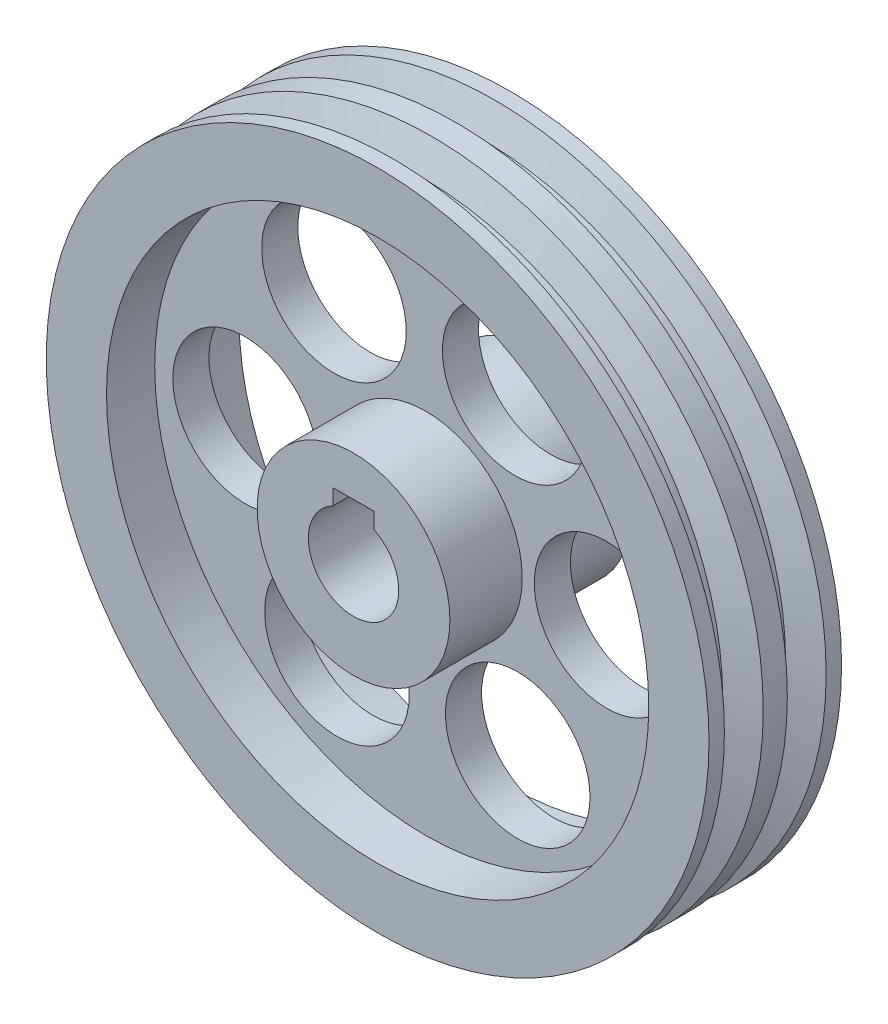
ISO-10303-21;
HEADER;
FILE_DESCRIPTION(('STEP AP214'),'2;1');
FILE_NAME('part.step','',(''),(''),'','','');
FILE_SCHEMA(('AUTOMOTIVE_DESIGN { 1 0 10303 214 1 1 1 1 }'));
ENDSEC;
DATA;
#1=APPLICATION_CONTEXT('core data for automotive mechanical design processes');
#2=APPLICATION_PROTOCOL_DEFINITION('international standard','automotive_design',2000,#1);
#3=PRODUCT_CONTEXT('',#1,'mechanical');
#4=PRODUCT('Part','Part','',(#3));
#5=PRODUCT_RELATED_PRODUCT_CATEGORY('part','',(#4));
#6=PRODUCT_DEFINITION_FORMATION('','',#4);
#7=PRODUCT_DEFINITION_CONTEXT('part definition',#1,'design');
#8=PRODUCT_DEFINITION('design','',#6,#7);
#9=PRODUCT_DEFINITION_SHAPE('','',#8);
#10=(LENGTH_UNIT() NAMED_UNIT(*) SI_UNIT(.MILLI.,.METRE.));
#11=(NAMED_UNIT(*) PLANE_ANGLE_UNIT() SI_UNIT($,.RADIAN.));
#12=(NAMED_UNIT(*) SI_UNIT($,.STERADIAN.) SOLID_ANGLE_UNIT());
#13=UNCERTAINTY_MEASURE_WITH_UNIT(LENGTH_MEASURE(1.E-05),#10,'distance_accuracy_value','');
#14=(GEOMETRIC_REPRESENTATION_CONTEXT(3) GLOBAL_UNCERTAINTY_ASSIGNED_CONTEXT((#13)) GLOBAL_UNIT_ASSIGNED_CONTEXT((#10,
#11,#12)) REPRESENTATION_CONTEXT('',''));
#15=CARTESIAN_POINT('',(0.,0.,0.));
#16=DIRECTION('',(0.,0.,1.));
#17=DIRECTION('',(1.,0.,0.));
#18=AXIS2_PLACEMENT_3D('',#15,#16,#17);
#19=CARTESIAN_POINT('',(0.,0.,15.));
#20=DIRECTION('',(0.,0.,-1.));
#21=DIRECTION('',(-1.,0.,0.));
#22=AXIS2_PLACEMENT_3D('',#19,#20,#21);
#23=CYLINDRICAL_SURFACE('',#22,16.);
#24=CARTESIAN_POINT('',(0.,0.,-15.));
#25=DIRECTION('',(0.,0.,1.));
#26=DIRECTION('',(1.,0.,0.));
#27=AXIS2_PLACEMENT_3D('',#24,#25,#26);
#28=CIRCLE('',#27,16.);
#29=CARTESIAN_POINT('',(16.,0.,-15.));
#30=VERTEX_POINT('',#29);
#31=EDGE_CURVE('E102',#30,#30,#28,.T.);
#32=ORIENTED_EDGE('',*,*,#31,.T.);
#33=EDGE_LOOP('',(#32));
#34=FACE_BOUND('',#33,.T.);
#35=CARTESIAN_POINT('',(0.,0.,-3.));
#36=DIRECTION('',(0.,0.,1.));
#37=DIRECTION('',(1.,0.,0.));
#38=AXIS2_PLACEMENT_3D('',#35,#36,#37);
#39=CIRCLE('',#38,16.);
#40=CARTESIAN_POINT('',(16.,0.,-3.));
#41=VERTEX_POINT('',#40);
#42=EDGE_CURVE('E11',#41,#41,#39,.T.);
#43=ORIENTED_EDGE('',*,*,#42,.F.);
#44=EDGE_LOOP('',(#43));
#45=FACE_BOUND('',#44,.T.);
#46=ADVANCED_FACE('F41',(#34,#45),#23,.T.);
#47=CARTESIAN_POINT('',(0.,0.,15.));
#48=DIRECTION('',(0.,0.,-1.));
#49=DIRECTION('',(-1.,0.,0.));
#50=AXIS2_PLACEMENT_3D('',#47,#48,#49);
#51=CYLINDRICAL_SURFACE('',#50,7.50000000000001);
#52=CARTESIAN_POINT('',(0.,0.,-15.));
#53=DIRECTION('',(0.,0.,1.));
#54=DIRECTION('',(1.,0.,0.));
#55=AXIS2_PLACEMENT_3D('',#52,#53,#54);
#56=CIRCLE('',#55,7.50000000000001);
#57=CARTESIAN_POINT('',(-3.41096359482936,6.67947058940669,-15.));
#58=VERTEX_POINT('',#57);
#59=CARTESIAN_POINT('',(3.41096359482936,6.67947058940669,-15.));
#60=VERTEX_POINT('',#59);
#61=EDGE_CURVE('E113',#58,#60,#56,.T.);
#62=ORIENTED_EDGE('',*,*,#61,.F.);
#63=DIRECTION('',(0.,0.,-1.));
#64=VECTOR('',#63,1.);
#65=CARTESIAN_POINT('',(-3.41096359482936,6.67947058940669,15.));
#66=LINE('',#65,#64);
#67=CARTESIAN_POINT('',(-3.41096359482936,6.67947058940669,15.));
#68=VERTEX_POINT('',#67);
#69=EDGE_CURVE('E49',#68,#58,#66,.T.);
#70=ORIENTED_EDGE('',*,*,#69,.F.);
#71=CARTESIAN_POINT('',(0.,0.,15.));
#72=DIRECTION('',(0.,0.,1.));
#73=DIRECTION('',(1.,0.,0.));
#74=AXIS2_PLACEMENT_3D('',#71,#72,#73);
#75=CIRCLE('',#74,7.50000000000001);
#76=CARTESIAN_POINT('',(3.41096359482936,6.67947058940669,15.));
#77=VERTEX_POINT('',#76);
#78=EDGE_CURVE('E101',#68,#77,#75,.T.);
#79=ORIENTED_EDGE('',*,*,#78,.T.);
#80=DIRECTION('',(0.,0.,-1.));
#81=VECTOR('',#80,1.);
#82=CARTESIAN_POINT('',(3.41096359482936,6.67947058940669,15.));
#83=LINE('',#82,#81);
#84=EDGE_CURVE('E82',#77,#60,#83,.T.);
#85=ORIENTED_EDGE('',*,*,#84,.T.);
#86=EDGE_LOOP('',(#62,#70,#79,#85));
#87=FACE_BOUND('',#86,.T.);
#88=ADVANCED_FACE('F43',(#87),#51,.F.);
#89=CARTESIAN_POINT('',(-3.41096359482936,0.,15.));
#90=DIRECTION('',(1.,0.,0.));
#91=DIRECTION('',(0.,0.,-1.));
#92=AXIS2_PLACEMENT_3D('',#89,#90,#91);
#93=PLANE('',#92);
#94=DIRECTION('',(0.,-1.,0.));
#95=VECTOR('',#94,1.);
#96=CARTESIAN_POINT('',(-3.41096359482936,0.,-15.));
#97=LINE('',#96,#95);
#98=CARTESIAN_POINT('',(-3.41096359482936,9.30988602341874,-15.));
#99=VERTEX_POINT('',#98);
#100=EDGE_CURVE('E94',#99,#58,#97,.T.);
#101=ORIENTED_EDGE('',*,*,#100,.F.);
#102=DIRECTION('',(0.,0.,-1.));
#103=VECTOR('',#102,1.);
#104=CARTESIAN_POINT('',(-3.41096359482936,9.30988602341874,15.));
#105=LINE('',#104,#103);
#106=CARTESIAN_POINT('',(-3.41096359482936,9.30988602341874,15.));
#107=VERTEX_POINT('',#106);
#108=EDGE_CURVE('E90',#107,#99,#105,.T.);
#109=ORIENTED_EDGE('',*,*,#108,.F.);
#110=DIRECTION('',(0.,-1.,0.));
#111=VECTOR('',#110,1.);
#112=CARTESIAN_POINT('',(-3.41096359482936,0.,15.));
#113=LINE('',#112,#111);
#114=EDGE_CURVE('E92',#107,#68,#113,.T.);
#115=ORIENTED_EDGE('',*,*,#114,.T.);
#116=ORIENTED_EDGE('',*,*,#69,.T.);
#117=EDGE_LOOP('',(#101,#109,#115,#116));
#118=FACE_BOUND('',#117,.T.);
#119=ADVANCED_FACE('F91',(#118),#93,.T.);
#120=CARTESIAN_POINT('',(0.,9.30988602341874,15.));
#121=DIRECTION('',(0.,1.,0.));
#122=DIRECTION('',(0.,0.,1.));
#123=AXIS2_PLACEMENT_3D('',#120,#121,#122);
#124=PLANE('',#123);
#125=DIRECTION('',(1.,0.,0.));
#126=VECTOR('',#125,1.);
#127=CARTESIAN_POINT('',(0.,9.30988602341874,-15.));
#128=LINE('',#127,#126);
#129=CARTESIAN_POINT('',(3.41096359482936,9.30988602341874,-15.));
#130=VERTEX_POINT('',#129);
#131=EDGE_CURVE('E73',#99,#130,#128,.T.);
#132=ORIENTED_EDGE('',*,*,#131,.T.);
#133=DIRECTION('',(0.,0.,-1.));
#134=VECTOR('',#133,1.);
#135=CARTESIAN_POINT('',(3.41096359482936,9.30988602341874,15.));
#136=LINE('',#135,#134);
#137=CARTESIAN_POINT('',(3.41096359482936,9.30988602341874,15.));
#138=VERTEX_POINT('',#137);
#139=EDGE_CURVE('E98',#138,#130,#136,.T.);
#140=ORIENTED_EDGE('',*,*,#139,.F.);
#141=DIRECTION('',(1.,0.,0.));
#142=VECTOR('',#141,1.);
#143=CARTESIAN_POINT('',(0.,9.30988602341874,15.));
#144=LINE('',#143,#142);
#145=EDGE_CURVE('E96',#107,#138,#144,.T.);
#146=ORIENTED_EDGE('',*,*,#145,.F.);
#147=ORIENTED_EDGE('',*,*,#108,.T.);
#148=EDGE_LOOP('',(#132,#140,#146,#147));
#149=FACE_BOUND('',#148,.T.);
#150=ADVANCED_FACE('F100',(#149),#124,.F.);
#151=CARTESIAN_POINT('',(3.41096359482936,0.,15.));
#152=DIRECTION('',(1.,0.,0.));
#153=DIRECTION('',(0.,0.,-1.));
#154=AXIS2_PLACEMENT_3D('',#151,#152,#153);
#155=PLANE('',#154);
#156=DIRECTION('',(0.,-1.,0.));
#157=VECTOR('',#156,1.);
#158=CARTESIAN_POINT('',(3.41096359482936,0.,-15.));
#159=LINE('',#158,#157);
#160=EDGE_CURVE('E118',#130,#60,#159,.T.);
#161=ORIENTED_EDGE('',*,*,#160,.T.);
#162=ORIENTED_EDGE('',*,*,#84,.F.);
#163=DIRECTION('',(0.,-1.,0.));
#164=VECTOR('',#163,1.);
#165=CARTESIAN_POINT('',(3.41096359482936,0.,15.));
#166=LINE('',#165,#164);
#167=EDGE_CURVE('E59',#138,#77,#166,.T.);
#168=ORIENTED_EDGE('',*,*,#167,.F.);
#169=ORIENTED_EDGE('',*,*,#139,.T.);
#170=EDGE_LOOP('',(#161,#162,#168,#169));
#171=FACE_BOUND('',#170,.T.);
#172=ADVANCED_FACE('F126',(#171),#155,.F.);
#173=CARTESIAN_POINT('',(0.,0.,3.));
#174=DIRECTION('',(0.,0.,1.));
#175=DIRECTION('',(1.,0.,0.));
#176=AXIS2_PLACEMENT_3D('',#173,#174,#175);
#177=CIRCLE('',#176,16.);
#178=CARTESIAN_POINT('',(16.,0.,3.));
#179=VERTEX_POINT('',#178);
#180=EDGE_CURVE('E116',#179,#179,#177,.T.);
#181=ORIENTED_EDGE('',*,*,#180,.T.);
#182=EDGE_LOOP('',(#181));
#183=FACE_BOUND('',#182,.T.);
#184=CARTESIAN_POINT('',(0.,0.,15.));
#185=DIRECTION('',(0.,0.,1.));
#186=DIRECTION('',(1.,0.,0.));
#187=AXIS2_PLACEMENT_3D('',#184,#185,#186);
#188=CIRCLE('',#187,16.);
#189=CARTESIAN_POINT('',(16.,0.,15.));
#190=VERTEX_POINT('',#189);
#191=EDGE_CURVE('E109',#190,#190,#188,.T.);
#192=ORIENTED_EDGE('',*,*,#191,.F.);
#193=EDGE_LOOP('',(#192));
#194=FACE_BOUND('',#193,.T.);
#195=ADVANCED_FACE('F133',(#183,#194),#23,.T.);
#196=CARTESIAN_POINT('',(0.,0.,15.));
#197=DIRECTION('',(0.,0.,1.));
#198=DIRECTION('',(1.,0.,0.));
#199=AXIS2_PLACEMENT_3D('',#196,#197,#198);
#200=PLANE('',#199);
#201=ORIENTED_EDGE('',*,*,#78,.F.);
#202=ORIENTED_EDGE('',*,*,#114,.F.);
#203=ORIENTED_EDGE('',*,*,#145,.T.);
#204=ORIENTED_EDGE('',*,*,#167,.T.);
#205=EDGE_LOOP('',(#201,#202,#203,#204));
#206=FACE_BOUND('',#205,.T.);
#207=ORIENTED_EDGE('',*,*,#191,.T.);
#208=EDGE_LOOP('',(#207));
#209=FACE_BOUND('',#208,.T.);
#210=ADVANCED_FACE('F103',(#206,#209),#200,.T.);
#211=CARTESIAN_POINT('',(0.,0.,-15.));
#212=DIRECTION('',(0.,0.,1.));
#213=DIRECTION('',(1.,0.,0.));
#214=AXIS2_PLACEMENT_3D('',#211,#212,#213);
#215=PLANE('',#214);
#216=ORIENTED_EDGE('',*,*,#61,.T.);
#217=ORIENTED_EDGE('',*,*,#160,.F.);
#218=ORIENTED_EDGE('',*,*,#131,.F.);
#219=ORIENTED_EDGE('',*,*,#100,.T.);
#220=EDGE_LOOP('',(#216,#217,#218,#219));
#221=FACE_BOUND('',#220,.T.);
#222=ORIENTED_EDGE('',*,*,#31,.F.);
#223=EDGE_LOOP('',(#222));
#224=FACE_BOUND('',#223,.T.);
#225=ADVANCED_FACE('F127',(#221,#224),#215,.F.);
#226=CARTESIAN_POINT('',(-14.7480525255609,-26.1246042401277,3.));
#227=DIRECTION('',(0.,0.,-1.));
#228=DIRECTION('',(-1.,0.,0.));
#229=AXIS2_PLACEMENT_3D('',#226,#227,#228);
#230=CYLINDRICAL_SURFACE('',#229,12.);
#231=CARTESIAN_POINT('',(-14.7480525255609,-26.1246042401277,3.));
#232=DIRECTION('',(0.,0.,1.));
#233=DIRECTION('',(1.,0.,0.));
#234=AXIS2_PLACEMENT_3D('',#231,#232,#233);
#235=CIRCLE('',#234,12.);
#236=CARTESIAN_POINT('',(-2.74805252556086,-26.1246042401277,3.));
#237=VERTEX_POINT('',#236);
#238=EDGE_CURVE('E288',#237,#237,#235,.T.);
#239=ORIENTED_EDGE('',*,*,#238,.T.);
#240=EDGE_LOOP('',(#239));
#241=FACE_BOUND('',#240,.T.);
#242=CARTESIAN_POINT('',(-14.7480525255609,-26.1246042401277,-3.));
#243=DIRECTION('',(0.,0.,1.));
#244=DIRECTION('',(1.,0.,0.));
#245=AXIS2_PLACEMENT_3D('',#242,#243,#244);
#246=CIRCLE('',#245,12.);
#247=CARTESIAN_POINT('',(-2.74805252556086,-26.1246042401277,-3.));
#248=VERTEX_POINT('',#247);
#249=EDGE_CURVE('E308',#248,#248,#246,.T.);
#250=ORIENTED_EDGE('',*,*,#249,.F.);
#251=EDGE_LOOP('',(#250));
#252=FACE_BOUND('',#251,.T.);
#253=ADVANCED_FACE('F148',(#241,#252),#230,.F.);
#254=CARTESIAN_POINT('',(15.2505446729849,-25.8344902635468,3.));
#255=DIRECTION('',(0.,0.,-1.));
#256=DIRECTION('',(-1.,0.,0.));
#257=AXIS2_PLACEMENT_3D('',#254,#255,#256);
#258=CYLINDRICAL_SURFACE('',#257,12.);
#259=CARTESIAN_POINT('',(15.2505446729849,-25.8344902635468,3.));
#260=DIRECTION('',(0.,0.,1.));
#261=DIRECTION('',(1.,0.,0.));
#262=AXIS2_PLACEMENT_3D('',#259,#260,#261);
#263=CIRCLE('',#262,12.);
#264=CARTESIAN_POINT('',(27.2505446729849,-25.8344902635468,3.));
#265=VERTEX_POINT('',#264);
#266=EDGE_CURVE('E286',#265,#265,#263,.T.);
#267=ORIENTED_EDGE('',*,*,#266,.T.);
#268=EDGE_LOOP('',(#267));
#269=FACE_BOUND('',#268,.T.);
#270=CARTESIAN_POINT('',(15.2505446729849,-25.8344902635468,-3.));
#271=DIRECTION('',(0.,0.,1.));
#272=DIRECTION('',(1.,0.,0.));
#273=AXIS2_PLACEMENT_3D('',#270,#271,#272);
#274=CIRCLE('',#273,12.);
#275=CARTESIAN_POINT('',(27.2505446729849,-25.8344902635468,-3.));
#276=VERTEX_POINT('',#275);
#277=EDGE_CURVE('E304',#276,#276,#274,.T.);
#278=ORIENTED_EDGE('',*,*,#277,.F.);
#279=EDGE_LOOP('',(#278));
#280=FACE_BOUND('',#279,.T.);
#281=ADVANCED_FACE('F166',(#269,#280),#258,.F.);
#282=CARTESIAN_POINT('',(29.9985971985457,0.290113976581059,3.));
#283=DIRECTION('',(0.,0.,-1.));
#284=DIRECTION('',(-1.,0.,0.));
#285=AXIS2_PLACEMENT_3D('',#282,#283,#284);
#286=CYLINDRICAL_SURFACE('',#285,12.);
#287=CARTESIAN_POINT('',(29.9985971985457,0.290113976581059,3.));
#288=DIRECTION('',(0.,0.,1.));
#289=DIRECTION('',(1.,0.,0.));
#290=AXIS2_PLACEMENT_3D('',#287,#288,#289);
#291=CIRCLE('',#290,12.);
#292=CARTESIAN_POINT('',(41.9985971985457,0.290113976581059,3.));
#293=VERTEX_POINT('',#292);
#294=EDGE_CURVE('E282',#293,#293,#291,.T.);
#295=ORIENTED_EDGE('',*,*,#294,.T.);
#296=EDGE_LOOP('',(#295));
#297=FACE_BOUND('',#296,.T.);
#298=CARTESIAN_POINT('',(29.9985971985457,0.290113976581059,-3.));
#299=DIRECTION('',(0.,0.,1.));
#300=DIRECTION('',(1.,0.,0.));
#301=AXIS2_PLACEMENT_3D('',#298,#299,#300);
#302=CIRCLE('',#301,12.);
#303=CARTESIAN_POINT('',(41.9985971985457,0.290113976581059,-3.));
#304=VERTEX_POINT('',#303);
#305=EDGE_CURVE('E305',#304,#304,#302,.T.);
#306=ORIENTED_EDGE('',*,*,#305,.F.);
#307=EDGE_LOOP('',(#306));
#308=FACE_BOUND('',#307,.T.);
#309=ADVANCED_FACE('F165',(#297,#308),#286,.F.);
#310=CARTESIAN_POINT('',(14.7480525255607,26.1246042401278,3.));
#311=DIRECTION('',(0.,0.,-1.));
#312=DIRECTION('',(-1.,0.,0.));
#313=AXIS2_PLACEMENT_3D('',#310,#311,#312);
#314=CYLINDRICAL_SURFACE('',#313,12.);
#315=CARTESIAN_POINT('',(14.7480525255607,26.1246042401278,3.));
#316=DIRECTION('',(0.,0.,1.));
#317=DIRECTION('',(1.,0.,0.));
#318=AXIS2_PLACEMENT_3D('',#315,#316,#317);
#319=CIRCLE('',#318,12.);
#320=CARTESIAN_POINT('',(26.7480525255607,26.1246042401278,3.));
#321=VERTEX_POINT('',#320);
#322=EDGE_CURVE('E278',#321,#321,#319,.T.);
#323=ORIENTED_EDGE('',*,*,#322,.T.);
#324=EDGE_LOOP('',(#323));
#325=FACE_BOUND('',#324,.T.);
#326=CARTESIAN_POINT('',(14.7480525255607,26.1246042401278,-3.));
#327=DIRECTION('',(0.,0.,1.));
#328=DIRECTION('',(1.,0.,0.));
#329=AXIS2_PLACEMENT_3D('',#326,#327,#328);
#330=CIRCLE('',#329,12.);
#331=CARTESIAN_POINT('',(26.7480525255607,26.1246042401278,-3.));
#332=VERTEX_POINT('',#331);
#333=EDGE_CURVE('E299',#332,#332,#330,.T.);
#334=ORIENTED_EDGE('',*,*,#333,.F.);
#335=EDGE_LOOP('',(#334));
#336=FACE_BOUND('',#335,.T.);
#337=ADVANCED_FACE('F159',(#325,#336),#314,.F.);
#338=CARTESIAN_POINT('',(-15.2505446729851,25.8344902635467,3.));
#339=DIRECTION('',(0.,0.,-1.));
#340=DIRECTION('',(-1.,0.,0.));
#341=AXIS2_PLACEMENT_3D('',#338,#339,#340);
#342=CYLINDRICAL_SURFACE('',#341,12.);
#343=CARTESIAN_POINT('',(-15.2505446729851,25.8344902635467,3.));
#344=DIRECTION('',(0.,0.,1.));
#345=DIRECTION('',(1.,0.,0.));
#346=AXIS2_PLACEMENT_3D('',#343,#344,#345);
#347=CIRCLE('',#346,12.);
#348=CARTESIAN_POINT('',(-3.25054467298509,25.8344902635467,3.));
#349=VERTEX_POINT('',#348);
#350=EDGE_CURVE('E277',#349,#349,#347,.T.);
#351=ORIENTED_EDGE('',*,*,#350,.T.);
#352=EDGE_LOOP('',(#351));
#353=FACE_BOUND('',#352,.T.);
#354=CARTESIAN_POINT('',(-15.2505446729851,25.8344902635467,-3.));
#355=DIRECTION('',(0.,0.,1.));
#356=DIRECTION('',(1.,0.,0.));
#357=AXIS2_PLACEMENT_3D('',#354,#355,#356);
#358=CIRCLE('',#357,12.);
#359=CARTESIAN_POINT('',(-3.25054467298509,25.8344902635467,-3.));
#360=VERTEX_POINT('',#359);
#361=EDGE_CURVE('E298',#360,#360,#358,.T.);
#362=ORIENTED_EDGE('',*,*,#361,.F.);
#363=EDGE_LOOP('',(#362));
#364=FACE_BOUND('',#363,.T.);
#365=ADVANCED_FACE('F156',(#353,#364),#342,.F.);
#366=CARTESIAN_POINT('',(-29.9985971985457,-0.290113976581263,3.));
#367=DIRECTION('',(0.,0.,-1.));
#368=DIRECTION('',(-1.,0.,0.));
#369=AXIS2_PLACEMENT_3D('',#366,#367,#368);
#370=CYLINDRICAL_SURFACE('',#369,12.);
#371=CARTESIAN_POINT('',(-29.9985971985457,-0.290113976581263,3.));
#372=DIRECTION('',(0.,0.,1.));
#373=DIRECTION('',(1.,0.,0.));
#374=AXIS2_PLACEMENT_3D('',#371,#372,#373);
#375=CIRCLE('',#374,12.);
#376=CARTESIAN_POINT('',(-17.9985971985457,-0.290113976581263,3.));
#377=VERTEX_POINT('',#376);
#378=EDGE_CURVE('E271',#377,#377,#375,.T.);
#379=ORIENTED_EDGE('',*,*,#378,.T.);
#380=EDGE_LOOP('',(#379));
#381=FACE_BOUND('',#380,.T.);
#382=CARTESIAN_POINT('',(-29.9985971985457,-0.290113976581263,-3.));
#383=DIRECTION('',(0.,0.,1.));
#384=DIRECTION('',(1.,0.,0.));
#385=AXIS2_PLACEMENT_3D('',#382,#383,#384);
#386=CIRCLE('',#385,12.);
#387=CARTESIAN_POINT('',(-17.9985971985457,-0.290113976581263,-3.));
#388=VERTEX_POINT('',#387);
#389=EDGE_CURVE('E275',#388,#388,#386,.T.);
#390=ORIENTED_EDGE('',*,*,#389,.F.);
#391=EDGE_LOOP('',(#390));
#392=FACE_BOUND('',#391,.T.);
#393=ADVANCED_FACE('F154',(#381,#392),#370,.F.);
#394=CARTESIAN_POINT('',(0.,0.,3.));
#395=DIRECTION('',(0.,0.,1.));
#396=DIRECTION('',(1.,0.,0.));
#397=AXIS2_PLACEMENT_3D('',#394,#395,#396);
#398=PLANE('',#397);
#399=ORIENTED_EDGE('',*,*,#378,.F.);
#400=EDGE_LOOP('',(#399));
#401=FACE_BOUND('',#400,.T.);
#402=ORIENTED_EDGE('',*,*,#350,.F.);
#403=EDGE_LOOP('',(#402));
#404=FACE_BOUND('',#403,.T.);
#405=ORIENTED_EDGE('',*,*,#322,.F.);
#406=EDGE_LOOP('',(#405));
#407=FACE_BOUND('',#406,.T.);
#408=ORIENTED_EDGE('',*,*,#294,.F.);
#409=EDGE_LOOP('',(#408));
#410=FACE_BOUND('',#409,.T.);
#411=ORIENTED_EDGE('',*,*,#266,.F.);
#412=EDGE_LOOP('',(#411));
#413=FACE_BOUND('',#412,.T.);
#414=ORIENTED_EDGE('',*,*,#238,.F.);
#415=EDGE_LOOP('',(#414));
#416=FACE_BOUND('',#415,.T.);
#417=ORIENTED_EDGE('',*,*,#180,.F.);
#418=EDGE_LOOP('',(#417));
#419=FACE_BOUND('',#418,.T.);
#420=CARTESIAN_POINT('',(0.,0.,3.));
#421=DIRECTION('',(0.,0.,1.));
#422=DIRECTION('',(1.,0.,0.));
#423=AXIS2_PLACEMENT_3D('',#420,#421,#422);
#424=CIRCLE('',#423,45.);
#425=CARTESIAN_POINT('',(45.,0.,3.));
#426=VERTEX_POINT('',#425);
#427=EDGE_CURVE('E261',#426,#426,#424,.F.);
#428=ORIENTED_EDGE('',*,*,#427,.F.);
#429=EDGE_LOOP('',(#428));
#430=FACE_BOUND('',#429,.T.);
#431=ADVANCED_FACE('F151',(#401,#404,#407,#410,#413,#416,#419,#430),#398,.T.);
#432=CARTESIAN_POINT('',(0.,0.,-3.));
#433=DIRECTION('',(0.,0.,1.));
#434=DIRECTION('',(1.,0.,0.));
#435=AXIS2_PLACEMENT_3D('',#432,#433,#434);
#436=PLANE('',#435);
#437=ORIENTED_EDGE('',*,*,#389,.T.);
#438=EDGE_LOOP('',(#437));
#439=FACE_BOUND('',#438,.T.);
#440=ORIENTED_EDGE('',*,*,#361,.T.);
#441=EDGE_LOOP('',(#440));
#442=FACE_BOUND('',#441,.T.);
#443=ORIENTED_EDGE('',*,*,#333,.T.);
#444=EDGE_LOOP('',(#443));
#445=FACE_BOUND('',#444,.T.);
#446=ORIENTED_EDGE('',*,*,#305,.T.);
#447=EDGE_LOOP('',(#446));
#448=FACE_BOUND('',#447,.T.);
#449=ORIENTED_EDGE('',*,*,#277,.T.);
#450=EDGE_LOOP('',(#449));
#451=FACE_BOUND('',#450,.T.);
#452=ORIENTED_EDGE('',*,*,#249,.T.);
#453=EDGE_LOOP('',(#452));
#454=FACE_BOUND('',#453,.T.);
#455=ORIENTED_EDGE('',*,*,#42,.T.);
#456=EDGE_LOOP('',(#455));
#457=FACE_BOUND('',#456,.T.);
#458=CARTESIAN_POINT('',(0.,0.,-3.));
#459=DIRECTION('',(0.,0.,1.));
#460=DIRECTION('',(1.,0.,0.));
#461=AXIS2_PLACEMENT_3D('',#458,#459,#460);
#462=CIRCLE('',#461,45.);
#463=CARTESIAN_POINT('',(45.,0.,-3.));
#464=VERTEX_POINT('',#463);
#465=EDGE_CURVE('E280',#464,#464,#462,.T.);
#466=ORIENTED_EDGE('',*,*,#465,.F.);
#467=EDGE_LOOP('',(#466));
#468=FACE_BOUND('',#467,.T.);
#469=ADVANCED_FACE('F176',(#439,#442,#445,#448,#451,#454,#457,#468),#436,.F.);
#470=CARTESIAN_POINT('',(0.,0.,11.));
#471=DIRECTION('',(0.,0.,-1.));
#472=DIRECTION('',(-1.,0.,0.));
#473=AXIS2_PLACEMENT_3D('',#470,#471,#472);
#474=CYLINDRICAL_SURFACE('',#473,45.);
#475=CARTESIAN_POINT('',(0.,0.,-11.));
#476=DIRECTION('',(0.,0.,1.));
#477=DIRECTION('',(1.,0.,0.));
#478=AXIS2_PLACEMENT_3D('',#475,#476,#477);
#479=CIRCLE('',#478,45.);
#480=CARTESIAN_POINT('',(45.,0.,-11.));
#481=VERTEX_POINT('',#480);
#482=EDGE_CURVE('E260',#481,#481,#479,.T.);
#483=ORIENTED_EDGE('',*,*,#482,.F.);
#484=EDGE_LOOP('',(#483));
#485=FACE_BOUND('',#484,.T.);
#486=ORIENTED_EDGE('',*,*,#465,.T.);
#487=EDGE_LOOP('',(#486));
#488=FACE_BOUND('',#487,.T.);
#489=ADVANCED_FACE('F177',(#485,#488),#474,.F.);
#490=CARTESIAN_POINT('',(0.,0.,11.));
#491=DIRECTION('',(0.,0.,-1.));
#492=DIRECTION('',(-1.,0.,0.));
#493=AXIS2_PLACEMENT_3D('',#490,#491,#492);
#494=CYLINDRICAL_SURFACE('',#493,55.);
#495=CARTESIAN_POINT('',(0.,0.,8.44327613289662));
#496=DIRECTION('',(0.,0.,1.));
#497=DIRECTION('',(1.,0.,0.));
#498=AXIS2_PLACEMENT_3D('',#495,#496,#497);
#499=CIRCLE('',#498,55.);
#500=CARTESIAN_POINT('',(55.,0.,8.44327613289662));
#501=VERTEX_POINT('',#500);
#502=EDGE_CURVE('E251',#501,#501,#499,.T.);
#503=ORIENTED_EDGE('',*,*,#502,.T.);
#504=EDGE_LOOP('',(#503));
#505=FACE_BOUND('',#504,.T.);
#506=CARTESIAN_POINT('',(0.,0.,11.));
#507=DIRECTION('',(0.,0.,1.));
#508=DIRECTION('',(1.,0.,0.));
#509=AXIS2_PLACEMENT_3D('',#506,#507,#508);
#510=CIRCLE('',#509,55.);
#511=CARTESIAN_POINT('',(55.,0.,11.));
#512=VERTEX_POINT('',#511);
#513=EDGE_CURVE('E263',#512,#512,#510,.T.);
#514=ORIENTED_EDGE('',*,*,#513,.F.);
#515=EDGE_LOOP('',(#514));
#516=FACE_BOUND('',#515,.T.);
#517=ADVANCED_FACE('F189',(#505,#516),#494,.T.);
#518=ORIENTED_EDGE('',*,*,#427,.T.);
#519=EDGE_LOOP('',(#518));
#520=FACE_BOUND('',#519,.T.);
#521=CARTESIAN_POINT('',(0.,0.,11.));
#522=DIRECTION('',(0.,0.,1.));
#523=DIRECTION('',(1.,0.,0.));
#524=AXIS2_PLACEMENT_3D('',#521,#522,#523);
#525=CIRCLE('',#524,45.);
#526=CARTESIAN_POINT('',(45.,0.,11.));
#527=VERTEX_POINT('',#526);
#528=EDGE_CURVE('E259',#527,#527,#525,.T.);
#529=ORIENTED_EDGE('',*,*,#528,.T.);
#530=EDGE_LOOP('',(#529));
#531=FACE_BOUND('',#530,.T.);
#532=ADVANCED_FACE('F183',(#520,#531),#474,.F.);
#533=CARTESIAN_POINT('',(0.,0.,-8.44327613289662));
#534=DIRECTION('',(0.,0.,1.));
#535=DIRECTION('',(1.,0.,0.));
#536=AXIS2_PLACEMENT_3D('',#533,#534,#535);
#537=CIRCLE('',#536,55.);
#538=CARTESIAN_POINT('',(55.,0.,-8.44327613289662));
#539=VERTEX_POINT('',#538);
#540=EDGE_CURVE('E232',#539,#539,#537,.T.);
#541=ORIENTED_EDGE('',*,*,#540,.F.);
#542=EDGE_LOOP('',(#541));
#543=FACE_BOUND('',#542,.T.);
#544=CARTESIAN_POINT('',(0.,0.,-11.));
#545=DIRECTION('',(0.,0.,1.));
#546=DIRECTION('',(1.,0.,0.));
#547=AXIS2_PLACEMENT_3D('',#544,#545,#546);
#548=CIRCLE('',#547,55.);
#549=CARTESIAN_POINT('',(55.,0.,-11.));
#550=VERTEX_POINT('',#549);
#551=EDGE_CURVE('E264',#550,#550,#548,.T.);
#552=ORIENTED_EDGE('',*,*,#551,.T.);
#553=EDGE_LOOP('',(#552));
#554=FACE_BOUND('',#553,.T.);
#555=ADVANCED_FACE('F190',(#543,#554),#494,.T.);
#556=CARTESIAN_POINT('',(0.,0.,11.));
#557=DIRECTION('',(0.,0.,1.));
#558=DIRECTION('',(1.,0.,0.));
#559=AXIS2_PLACEMENT_3D('',#556,#557,#558);
#560=PLANE('',#559);
#561=ORIENTED_EDGE('',*,*,#528,.F.);
#562=EDGE_LOOP('',(#561));
#563=FACE_BOUND('',#562,.T.);
#564=ORIENTED_EDGE('',*,*,#513,.T.);
#565=EDGE_LOOP('',(#564));
#566=FACE_BOUND('',#565,.T.);
#567=ADVANCED_FACE('F195',(#563,#566),#560,.T.);
#568=CARTESIAN_POINT('',(0.,0.,-11.));
#569=DIRECTION('',(0.,0.,1.));
#570=DIRECTION('',(1.,0.,0.));
#571=AXIS2_PLACEMENT_3D('',#568,#569,#570);
#572=PLANE('',#571);
#573=ORIENTED_EDGE('',*,*,#482,.T.);
#574=EDGE_LOOP('',(#573));
#575=FACE_BOUND('',#574,.T.);
#576=ORIENTED_EDGE('',*,*,#551,.F.);
#577=EDGE_LOOP('',(#576));
#578=FACE_BOUND('',#577,.T.);
#579=ADVANCED_FACE('F193',(#575,#578),#572,.F.);
#580=CARTESIAN_POINT('',(0.,0.,-3.72163806644833));
#581=DIRECTION('',(0.,0.,1.));
#582=DIRECTION('',(1.,0.,0.));
#583=AXIS2_PLACEMENT_3D('',#580,#581,#582);
#584=CONICAL_SURFACE('',#583,50.,1.23918376891597);
#585=CARTESIAN_POINT('',(0.,0.,-2.));
#586=DIRECTION('',(0.,0.,1.));
#587=DIRECTION('',(1.,0.,0.));
#588=AXIS2_PLACEMENT_3D('',#585,#586,#587);
#589=CIRCLE('',#588,55.);
#590=CARTESIAN_POINT('',(55.,0.,-2.));
#591=VERTEX_POINT('',#590);
#592=EDGE_CURVE('E245',#591,#591,#589,.T.);
#593=ORIENTED_EDGE('',*,*,#592,.F.);
#594=EDGE_LOOP('',(#593));
#595=FACE_BOUND('',#594,.T.);
#596=CARTESIAN_POINT('',(0.,0.,-3.72163806644833));
#597=DIRECTION('',(0.,0.,1.));
#598=DIRECTION('',(1.,0.,0.));
#599=AXIS2_PLACEMENT_3D('',#596,#597,#598);
#600=CIRCLE('',#599,50.);
#601=CARTESIAN_POINT('',(50.,0.,-3.72163806644833));
#602=VERTEX_POINT('',#601);
#603=EDGE_CURVE('E240',#602,#602,#600,.T.);
#604=ORIENTED_EDGE('',*,*,#603,.T.);
#605=EDGE_LOOP('',(#604));
#606=FACE_BOUND('',#605,.T.);
#607=ADVANCED_FACE('F197',(#595,#606),#584,.T.);
#608=CARTESIAN_POINT('',(0.,0.,1.85354738859201));
#609=DIRECTION('',(0.,0.,1.));
#610=DIRECTION('',(1.,0.,0.));
#611=AXIS2_PLACEMENT_3D('',#608,#609,#610);
#612=CYLINDRICAL_SURFACE('',#611,50.);
#613=ORIENTED_EDGE('',*,*,#603,.F.);
#614=EDGE_LOOP('',(#613));
#615=FACE_BOUND('',#614,.T.);
#616=CARTESIAN_POINT('',(0.,0.,-6.72163806644833));
#617=DIRECTION('',(0.,0.,1.));
#618=DIRECTION('',(1.,0.,0.));
#619=AXIS2_PLACEMENT_3D('',#616,#617,#618);
#620=CIRCLE('',#619,50.);
#621=CARTESIAN_POINT('',(50.,0.,-6.72163806644833));
#622=VERTEX_POINT('',#621);
#623=EDGE_CURVE('E235',#622,#622,#620,.T.);
#624=ORIENTED_EDGE('',*,*,#623,.T.);
#625=EDGE_LOOP('',(#624));
#626=FACE_BOUND('',#625,.T.);
#627=ADVANCED_FACE('F219',(#615,#626),#612,.T.);
#628=CARTESIAN_POINT('',(0.,0.,-8.44327613289662));
#629=DIRECTION('',(0.,0.,-1.));
#630=DIRECTION('',(-1.,0.,0.));
#631=AXIS2_PLACEMENT_3D('',#628,#629,#630);
#632=CONICAL_SURFACE('',#631,55.,1.23918376891598);
#633=ORIENTED_EDGE('',*,*,#623,.F.);
#634=EDGE_LOOP('',(#633));
#635=FACE_BOUND('',#634,.T.);
#636=ORIENTED_EDGE('',*,*,#540,.T.);
#637=EDGE_LOOP('',(#636));
#638=FACE_BOUND('',#637,.T.);
#639=ADVANCED_FACE('F221',(#635,#638),#632,.T.);
#640=CARTESIAN_POINT('',(0.,0.,2.));
#641=DIRECTION('',(0.,0.,1.));
#642=DIRECTION('',(1.,0.,0.));
#643=AXIS2_PLACEMENT_3D('',#640,#641,#642);
#644=CIRCLE('',#643,55.);
#645=CARTESIAN_POINT('',(55.,0.,2.));
#646=VERTEX_POINT('',#645);
#647=EDGE_CURVE('E244',#646,#646,#644,.T.);
#648=ORIENTED_EDGE('',*,*,#647,.F.);
#649=EDGE_LOOP('',(#648));
#650=FACE_BOUND('',#649,.T.);
#651=ORIENTED_EDGE('',*,*,#592,.T.);
#652=EDGE_LOOP('',(#651));
#653=FACE_BOUND('',#652,.T.);
#654=ADVANCED_FACE('F191',(#650,#653),#494,.T.);
#655=CARTESIAN_POINT('',(0.,0.,6.72163806644833));
#656=DIRECTION('',(0.,0.,1.));
#657=DIRECTION('',(1.,0.,0.));
#658=AXIS2_PLACEMENT_3D('',#655,#656,#657);
#659=CONICAL_SURFACE('',#658,50.,1.23918376891598);
#660=ORIENTED_EDGE('',*,*,#502,.F.);
#661=EDGE_LOOP('',(#660));
#662=FACE_BOUND('',#661,.T.);
#663=CARTESIAN_POINT('',(0.,0.,6.72163806644833));
#664=DIRECTION('',(0.,0.,1.));
#665=DIRECTION('',(1.,0.,0.));
#666=AXIS2_PLACEMENT_3D('',#663,#664,#665);
#667=CIRCLE('',#666,50.);
#668=CARTESIAN_POINT('',(50.,0.,6.72163806644833));
#669=VERTEX_POINT('',#668);
#670=EDGE_CURVE('E252',#669,#669,#667,.T.);
#671=ORIENTED_EDGE('',*,*,#670,.T.);
#672=EDGE_LOOP('',(#671));
#673=FACE_BOUND('',#672,.T.);
#674=ADVANCED_FACE('F202',(#662,#673),#659,.T.);
#675=CARTESIAN_POINT('',(0.,0.,1.85354738859201));
#676=DIRECTION('',(0.,0.,1.));
#677=DIRECTION('',(1.,0.,0.));
#678=AXIS2_PLACEMENT_3D('',#675,#676,#677);
#679=CYLINDRICAL_SURFACE('',#678,50.);
#680=ORIENTED_EDGE('',*,*,#670,.F.);
#681=EDGE_LOOP('',(#680));
#682=FACE_BOUND('',#681,.T.);
#683=CARTESIAN_POINT('',(0.,0.,3.72163806644833));
#684=DIRECTION('',(0.,0.,1.));
#685=DIRECTION('',(1.,0.,0.));
#686=AXIS2_PLACEMENT_3D('',#683,#684,#685);
#687=CIRCLE('',#686,50.);
#688=CARTESIAN_POINT('',(50.,0.,3.72163806644833));
#689=VERTEX_POINT('',#688);
#690=EDGE_CURVE('E247',#689,#689,#687,.T.);
#691=ORIENTED_EDGE('',*,*,#690,.T.);
#692=EDGE_LOOP('',(#691));
#693=FACE_BOUND('',#692,.T.);
#694=ADVANCED_FACE('F207',(#682,#693),#679,.T.);
#695=CARTESIAN_POINT('',(0.,0.,2.));
#696=DIRECTION('',(0.,0.,-1.));
#697=DIRECTION('',(-1.,0.,0.));
#698=AXIS2_PLACEMENT_3D('',#695,#696,#697);
#699=CONICAL_SURFACE('',#698,55.,1.23918376891597);
#700=ORIENTED_EDGE('',*,*,#690,.F.);
#701=EDGE_LOOP('',(#700));
#702=FACE_BOUND('',#701,.T.);
#703=ORIENTED_EDGE('',*,*,#647,.T.);
#704=EDGE_LOOP('',(#703));
#705=FACE_BOUND('',#704,.T.);
#706=ADVANCED_FACE('F208',(#702,#705),#699,.T.);
#707=CLOSED_SHELL('',(#46,#88,#119,#150,#172,#195,#210,#225,#253,#281,#309,#337,#365,#393,#431,
#469,#489,#517,#532,#555,#567,#579,#607,#627,#639,#654,#674,#694,#706));
#708=MANIFOLD_SOLID_BREP('B2',#707);
#709=ADVANCED_BREP_SHAPE_REPRESENTATION('',(#18,#708),#14);
#710=SHAPE_DEFINITION_REPRESENTATION(#9,#709);
ENDSEC;
END-ISO-10303-21;
